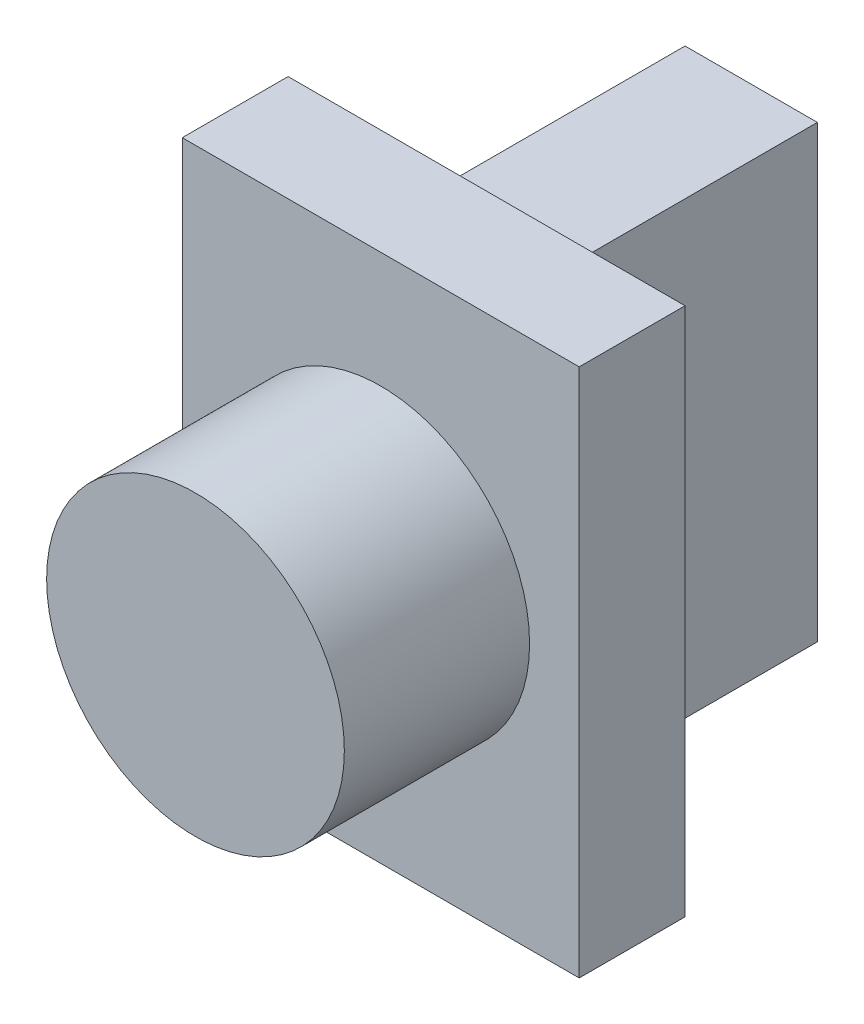
ISO-10303-21;
HEADER;
FILE_DESCRIPTION(('STEP AP214'),'2;1');
FILE_NAME('part.step','',(''),(''),'','','');
FILE_SCHEMA(('AUTOMOTIVE_DESIGN { 1 0 10303 214 1 1 1 1 }'));
ENDSEC;
DATA;
#1=APPLICATION_CONTEXT('core data for automotive mechanical design processes');
#2=APPLICATION_PROTOCOL_DEFINITION('international standard','automotive_design',2000,#1);
#3=PRODUCT_CONTEXT('',#1,'mechanical');
#4=PRODUCT('Part','Part','',(#3));
#5=PRODUCT_RELATED_PRODUCT_CATEGORY('part','',(#4));
#6=PRODUCT_DEFINITION_FORMATION('','',#4);
#7=PRODUCT_DEFINITION_CONTEXT('part definition',#1,'design');
#8=PRODUCT_DEFINITION('design','',#6,#7);
#9=PRODUCT_DEFINITION_SHAPE('','',#8);
#10=(LENGTH_UNIT() NAMED_UNIT(*) SI_UNIT(.MILLI.,.METRE.));
#11=(NAMED_UNIT(*) PLANE_ANGLE_UNIT() SI_UNIT($,.RADIAN.));
#12=(NAMED_UNIT(*) SI_UNIT($,.STERADIAN.) SOLID_ANGLE_UNIT());
#13=UNCERTAINTY_MEASURE_WITH_UNIT(LENGTH_MEASURE(1.E-05),#10,'distance_accuracy_value','');
#14=(GEOMETRIC_REPRESENTATION_CONTEXT(3) GLOBAL_UNCERTAINTY_ASSIGNED_CONTEXT((#13)) GLOBAL_UNIT_ASSIGNED_CONTEXT((#10,
#11,#12)) REPRESENTATION_CONTEXT('',''));
#15=CARTESIAN_POINT('',(0.,0.,0.));
#16=DIRECTION('',(0.,0.,1.));
#17=DIRECTION('',(1.,0.,0.));
#18=AXIS2_PLACEMENT_3D('',#15,#16,#17);
#19=CARTESIAN_POINT('',(-15.,-20.,8.00000000000001));
#20=DIRECTION('',(0.,0.,1.));
#21=DIRECTION('',(1.,0.,0.));
#22=AXIS2_PLACEMENT_3D('',#19,#20,#21);
#23=PLANE('',#22);
#24=DIRECTION('',(0.,-1.,0.));
#25=VECTOR('',#24,1.);
#26=CARTESIAN_POINT('',(-15.,20.,8.00000000000001));
#27=LINE('',#26,#25);
#28=CARTESIAN_POINT('',(-15.,20.,8.00000000000001));
#29=VERTEX_POINT('',#28);
#30=CARTESIAN_POINT('',(-15.,-20.,8.00000000000001));
#31=VERTEX_POINT('',#30);
#32=EDGE_CURVE('E137',#29,#31,#27,.T.);
#33=ORIENTED_EDGE('',*,*,#32,.T.);
#34=DIRECTION('',(1.,0.,0.));
#35=VECTOR('',#34,1.);
#36=CARTESIAN_POINT('',(-15.,-20.,8.00000000000001));
#37=LINE('',#36,#35);
#38=CARTESIAN_POINT('',(15.,-20.,8.00000000000001));
#39=VERTEX_POINT('',#38);
#40=EDGE_CURVE('E140',#31,#39,#37,.T.);
#41=ORIENTED_EDGE('',*,*,#40,.T.);
#42=DIRECTION('',(0.,1.,0.));
#43=VECTOR('',#42,1.);
#44=CARTESIAN_POINT('',(15.,20.,8.00000000000001));
#45=LINE('',#44,#43);
#46=CARTESIAN_POINT('',(15.,20.,8.00000000000001));
#47=VERTEX_POINT('',#46);
#48=EDGE_CURVE('E142',#39,#47,#45,.T.);
#49=ORIENTED_EDGE('',*,*,#48,.T.);
#50=DIRECTION('',(-1.,0.,0.));
#51=VECTOR('',#50,1.);
#52=CARTESIAN_POINT('',(-15.,20.,8.00000000000001));
#53=LINE('',#52,#51);
#54=EDGE_CURVE('E144',#47,#29,#53,.T.);
#55=ORIENTED_EDGE('',*,*,#54,.T.);
#56=EDGE_LOOP('',(#33,#41,#49,#55));
#57=FACE_BOUND('',#56,.T.);
#58=CARTESIAN_POINT('',(0.,0.,8.00000000000001));
#59=DIRECTION('',(0.,0.,1.));
#60=DIRECTION('',(1.,0.,0.));
#61=AXIS2_PLACEMENT_3D('',#58,#59,#60);
#62=CIRCLE('',#61,11.25);
#63=CARTESIAN_POINT('',(11.25,0.,8.00000000000001));
#64=VERTEX_POINT('',#63);
#65=EDGE_CURVE('E218',#64,#64,#62,.T.);
#66=ORIENTED_EDGE('',*,*,#65,.F.);
#67=EDGE_LOOP('',(#66));
#68=FACE_BOUND('',#67,.T.);
#69=ADVANCED_FACE('F33',(#57,#68),#23,.T.);
#70=CARTESIAN_POINT('',(-15.,-20.,0.));
#71=DIRECTION('',(0.,0.,1.));
#72=DIRECTION('',(1.,0.,0.));
#73=AXIS2_PLACEMENT_3D('',#70,#71,#72);
#74=PLANE('',#73);
#75=DIRECTION('',(0.,-1.,0.));
#76=VECTOR('',#75,1.);
#77=CARTESIAN_POINT('',(-15.,20.,0.));
#78=LINE('',#77,#76);
#79=CARTESIAN_POINT('',(-15.,20.,0.));
#80=VERTEX_POINT('',#79);
#81=CARTESIAN_POINT('',(-15.,-20.,0.));
#82=VERTEX_POINT('',#81);
#83=EDGE_CURVE('E128',#80,#82,#78,.T.);
#84=ORIENTED_EDGE('',*,*,#83,.F.);
#85=DIRECTION('',(-1.,0.,0.));
#86=VECTOR('',#85,1.);
#87=CARTESIAN_POINT('',(-15.,20.,0.));
#88=LINE('',#87,#86);
#89=CARTESIAN_POINT('',(15.,20.,0.));
#90=VERTEX_POINT('',#89);
#91=EDGE_CURVE('E135',#90,#80,#88,.T.);
#92=ORIENTED_EDGE('',*,*,#91,.F.);
#93=DIRECTION('',(0.,1.,0.));
#94=VECTOR('',#93,1.);
#95=CARTESIAN_POINT('',(15.,20.,0.));
#96=LINE('',#95,#94);
#97=CARTESIAN_POINT('',(15.,-20.,0.));
#98=VERTEX_POINT('',#97);
#99=EDGE_CURVE('E133',#98,#90,#96,.T.);
#100=ORIENTED_EDGE('',*,*,#99,.F.);
#101=DIRECTION('',(1.,0.,0.));
#102=VECTOR('',#101,1.);
#103=CARTESIAN_POINT('',(-15.,-20.,0.));
#104=LINE('',#103,#102);
#105=EDGE_CURVE('E131',#82,#98,#104,.T.);
#106=ORIENTED_EDGE('',*,*,#105,.F.);
#107=EDGE_LOOP('',(#84,#92,#100,#106));
#108=FACE_BOUND('',#107,.T.);
#109=DIRECTION('',(0.,-1.,0.));
#110=VECTOR('',#109,1.);
#111=CARTESIAN_POINT('',(5.,17.,0.));
#112=LINE('',#111,#110);
#113=CARTESIAN_POINT('',(5.,17.,0.));
#114=VERTEX_POINT('',#113);
#115=CARTESIAN_POINT('',(5.,-17.,0.));
#116=VERTEX_POINT('',#115);
#117=EDGE_CURVE('E94',#114,#116,#112,.T.);
#118=ORIENTED_EDGE('',*,*,#117,.F.);
#119=DIRECTION('',(1.,0.,0.));
#120=VECTOR('',#119,1.);
#121=CARTESIAN_POINT('',(5.,17.,0.));
#122=LINE('',#121,#120);
#123=CARTESIAN_POINT('',(-5.,17.,0.));
#124=VERTEX_POINT('',#123);
#125=EDGE_CURVE('E97',#124,#114,#122,.T.);
#126=ORIENTED_EDGE('',*,*,#125,.F.);
#127=DIRECTION('',(0.,1.,0.));
#128=VECTOR('',#127,1.);
#129=CARTESIAN_POINT('',(-5.,17.,0.));
#130=LINE('',#129,#128);
#131=CARTESIAN_POINT('',(-5.,-17.,0.));
#132=VERTEX_POINT('',#131);
#133=EDGE_CURVE('E53',#132,#124,#130,.T.);
#134=ORIENTED_EDGE('',*,*,#133,.F.);
#135=DIRECTION('',(-1.,0.,0.));
#136=VECTOR('',#135,1.);
#137=CARTESIAN_POINT('',(5.,-17.,0.));
#138=LINE('',#137,#136);
#139=EDGE_CURVE('E48',#116,#132,#138,.T.);
#140=ORIENTED_EDGE('',*,*,#139,.F.);
#141=EDGE_LOOP('',(#118,#126,#134,#140));
#142=FACE_BOUND('',#141,.T.);
#143=ADVANCED_FACE('F96',(#108,#142),#74,.F.);
#144=CARTESIAN_POINT('',(-15.,20.,8.00000000000001));
#145=DIRECTION('',(1.,0.,0.));
#146=DIRECTION('',(0.,0.,-1.));
#147=AXIS2_PLACEMENT_3D('',#144,#145,#146);
#148=PLANE('',#147);
#149=ORIENTED_EDGE('',*,*,#83,.T.);
#150=DIRECTION('',(0.,0.,-1.));
#151=VECTOR('',#150,1.);
#152=CARTESIAN_POINT('',(-15.,-20.,8.00000000000001));
#153=LINE('',#152,#151);
#154=EDGE_CURVE('E11',#31,#82,#153,.T.);
#155=ORIENTED_EDGE('',*,*,#154,.F.);
#156=ORIENTED_EDGE('',*,*,#32,.F.);
#157=DIRECTION('',(0.,0.,-1.));
#158=VECTOR('',#157,1.);
#159=CARTESIAN_POINT('',(-15.,20.,8.00000000000001));
#160=LINE('',#159,#158);
#161=EDGE_CURVE('E146',#29,#80,#160,.T.);
#162=ORIENTED_EDGE('',*,*,#161,.T.);
#163=EDGE_LOOP('',(#149,#155,#156,#162));
#164=FACE_BOUND('',#163,.T.);
#165=ADVANCED_FACE('F35',(#164),#148,.F.);
#166=CARTESIAN_POINT('',(-15.,-20.,8.00000000000001));
#167=DIRECTION('',(0.,1.,0.));
#168=DIRECTION('',(0.,0.,1.));
#169=AXIS2_PLACEMENT_3D('',#166,#167,#168);
#170=PLANE('',#169);
#171=ORIENTED_EDGE('',*,*,#105,.T.);
#172=DIRECTION('',(0.,0.,-1.));
#173=VECTOR('',#172,1.);
#174=CARTESIAN_POINT('',(15.,-20.,8.00000000000001));
#175=LINE('',#174,#173);
#176=EDGE_CURVE('E41',#39,#98,#175,.T.);
#177=ORIENTED_EDGE('',*,*,#176,.F.);
#178=ORIENTED_EDGE('',*,*,#40,.F.);
#179=ORIENTED_EDGE('',*,*,#154,.T.);
#180=EDGE_LOOP('',(#171,#177,#178,#179));
#181=FACE_BOUND('',#180,.T.);
#182=ADVANCED_FACE('F171',(#181),#170,.F.);
#183=CARTESIAN_POINT('',(15.,20.,8.00000000000001));
#184=DIRECTION('',(-1.,0.,0.));
#185=DIRECTION('',(0.,-1.,0.));
#186=AXIS2_PLACEMENT_3D('',#183,#184,#185);
#187=PLANE('',#186);
#188=ORIENTED_EDGE('',*,*,#99,.T.);
#189=DIRECTION('',(0.,0.,-1.));
#190=VECTOR('',#189,1.);
#191=CARTESIAN_POINT('',(15.,20.,8.00000000000001));
#192=LINE('',#191,#190);
#193=EDGE_CURVE('E149',#47,#90,#192,.T.);
#194=ORIENTED_EDGE('',*,*,#193,.F.);
#195=ORIENTED_EDGE('',*,*,#48,.F.);
#196=ORIENTED_EDGE('',*,*,#176,.T.);
#197=EDGE_LOOP('',(#188,#194,#195,#196));
#198=FACE_BOUND('',#197,.T.);
#199=ADVANCED_FACE('F156',(#198),#187,.F.);
#200=CARTESIAN_POINT('',(-15.,20.,8.00000000000001));
#201=DIRECTION('',(0.,-1.,0.));
#202=DIRECTION('',(0.,0.,-1.));
#203=AXIS2_PLACEMENT_3D('',#200,#201,#202);
#204=PLANE('',#203);
#205=ORIENTED_EDGE('',*,*,#91,.T.);
#206=ORIENTED_EDGE('',*,*,#161,.F.);
#207=ORIENTED_EDGE('',*,*,#54,.F.);
#208=ORIENTED_EDGE('',*,*,#193,.T.);
#209=EDGE_LOOP('',(#205,#206,#207,#208));
#210=FACE_BOUND('',#209,.T.);
#211=ADVANCED_FACE('F164',(#210),#204,.F.);
#212=CARTESIAN_POINT('',(5.,17.,-20.));
#213=DIRECTION('',(-1.,0.,0.));
#214=DIRECTION('',(0.,-1.,0.));
#215=AXIS2_PLACEMENT_3D('',#212,#213,#214);
#216=PLANE('',#215);
#217=ORIENTED_EDGE('',*,*,#117,.T.);
#218=DIRECTION('',(0.,0.,1.));
#219=VECTOR('',#218,1.);
#220=CARTESIAN_POINT('',(5.,-17.,-20.));
#221=LINE('',#220,#219);
#222=CARTESIAN_POINT('',(5.,-17.,-20.));
#223=VERTEX_POINT('',#222);
#224=EDGE_CURVE('E126',#223,#116,#221,.T.);
#225=ORIENTED_EDGE('',*,*,#224,.F.);
#226=DIRECTION('',(0.,-1.,0.));
#227=VECTOR('',#226,1.);
#228=CARTESIAN_POINT('',(5.,17.,-20.));
#229=LINE('',#228,#227);
#230=CARTESIAN_POINT('',(5.,17.,-20.));
#231=VERTEX_POINT('',#230);
#232=EDGE_CURVE('E112',#231,#223,#229,.T.);
#233=ORIENTED_EDGE('',*,*,#232,.F.);
#234=DIRECTION('',(0.,0.,1.));
#235=VECTOR('',#234,1.);
#236=CARTESIAN_POINT('',(5.,17.,-20.));
#237=LINE('',#236,#235);
#238=EDGE_CURVE('E108',#231,#114,#237,.T.);
#239=ORIENTED_EDGE('',*,*,#238,.T.);
#240=EDGE_LOOP('',(#217,#225,#233,#239));
#241=FACE_BOUND('',#240,.T.);
#242=ADVANCED_FACE('F114',(#241),#216,.F.);
#243=CARTESIAN_POINT('',(5.,-17.,-20.));
#244=DIRECTION('',(0.,1.,0.));
#245=DIRECTION('',(0.,0.,1.));
#246=AXIS2_PLACEMENT_3D('',#243,#244,#245);
#247=PLANE('',#246);
#248=ORIENTED_EDGE('',*,*,#139,.T.);
#249=DIRECTION('',(0.,0.,1.));
#250=VECTOR('',#249,1.);
#251=CARTESIAN_POINT('',(-5.,-17.,-20.));
#252=LINE('',#251,#250);
#253=CARTESIAN_POINT('',(-5.,-17.,-20.));
#254=VERTEX_POINT('',#253);
#255=EDGE_CURVE('E118',#254,#132,#252,.T.);
#256=ORIENTED_EDGE('',*,*,#255,.F.);
#257=DIRECTION('',(-1.,0.,0.));
#258=VECTOR('',#257,1.);
#259=CARTESIAN_POINT('',(5.,-17.,-20.));
#260=LINE('',#259,#258);
#261=EDGE_CURVE('E226',#223,#254,#260,.T.);
#262=ORIENTED_EDGE('',*,*,#261,.F.);
#263=ORIENTED_EDGE('',*,*,#224,.T.);
#264=EDGE_LOOP('',(#248,#256,#262,#263));
#265=FACE_BOUND('',#264,.T.);
#266=ADVANCED_FACE('F190',(#265),#247,.F.);
#267=CARTESIAN_POINT('',(-5.,17.,-20.));
#268=DIRECTION('',(1.,0.,0.));
#269=DIRECTION('',(0.,1.,0.));
#270=AXIS2_PLACEMENT_3D('',#267,#268,#269);
#271=PLANE('',#270);
#272=ORIENTED_EDGE('',*,*,#133,.T.);
#273=DIRECTION('',(0.,0.,1.));
#274=VECTOR('',#273,1.);
#275=CARTESIAN_POINT('',(-5.,17.,-20.));
#276=LINE('',#275,#274);
#277=CARTESIAN_POINT('',(-5.,17.,-20.));
#278=VERTEX_POINT('',#277);
#279=EDGE_CURVE('E111',#278,#124,#276,.T.);
#280=ORIENTED_EDGE('',*,*,#279,.F.);
#281=DIRECTION('',(0.,1.,0.));
#282=VECTOR('',#281,1.);
#283=CARTESIAN_POINT('',(-5.,17.,-20.));
#284=LINE('',#283,#282);
#285=EDGE_CURVE('E120',#254,#278,#284,.T.);
#286=ORIENTED_EDGE('',*,*,#285,.F.);
#287=ORIENTED_EDGE('',*,*,#255,.T.);
#288=EDGE_LOOP('',(#272,#280,#286,#287));
#289=FACE_BOUND('',#288,.T.);
#290=ADVANCED_FACE('F194',(#289),#271,.F.);
#291=CARTESIAN_POINT('',(5.,17.,-20.));
#292=DIRECTION('',(0.,-1.,0.));
#293=DIRECTION('',(0.,0.,-1.));
#294=AXIS2_PLACEMENT_3D('',#291,#292,#293);
#295=PLANE('',#294);
#296=ORIENTED_EDGE('',*,*,#125,.T.);
#297=ORIENTED_EDGE('',*,*,#238,.F.);
#298=DIRECTION('',(1.,0.,0.));
#299=VECTOR('',#298,1.);
#300=CARTESIAN_POINT('',(5.,17.,-20.));
#301=LINE('',#300,#299);
#302=EDGE_CURVE('E116',#278,#231,#301,.T.);
#303=ORIENTED_EDGE('',*,*,#302,.F.);
#304=ORIENTED_EDGE('',*,*,#279,.T.);
#305=EDGE_LOOP('',(#296,#297,#303,#304));
#306=FACE_BOUND('',#305,.T.);
#307=ADVANCED_FACE('F106',(#306),#295,.F.);
#308=CARTESIAN_POINT('',(5.,-17.,-20.));
#309=DIRECTION('',(0.,0.,-1.));
#310=DIRECTION('',(-1.,0.,0.));
#311=AXIS2_PLACEMENT_3D('',#308,#309,#310);
#312=PLANE('',#311);
#313=ORIENTED_EDGE('',*,*,#232,.T.);
#314=ORIENTED_EDGE('',*,*,#261,.T.);
#315=ORIENTED_EDGE('',*,*,#285,.T.);
#316=ORIENTED_EDGE('',*,*,#302,.T.);
#317=EDGE_LOOP('',(#313,#314,#315,#316));
#318=FACE_BOUND('',#317,.T.);
#319=ADVANCED_FACE('F203',(#318),#312,.T.);
#320=CARTESIAN_POINT('',(0.,0.,22.));
#321=DIRECTION('',(0.,0.,-1.));
#322=DIRECTION('',(-1.,0.,0.));
#323=AXIS2_PLACEMENT_3D('',#320,#321,#322);
#324=CYLINDRICAL_SURFACE('',#323,11.25);
#325=CARTESIAN_POINT('',(0.,0.,22.));
#326=DIRECTION('',(0.,0.,1.));
#327=DIRECTION('',(1.,0.,0.));
#328=AXIS2_PLACEMENT_3D('',#325,#326,#327);
#329=CIRCLE('',#328,11.25);
#330=CARTESIAN_POINT('',(11.25,0.,22.));
#331=VERTEX_POINT('',#330);
#332=EDGE_CURVE('E101',#331,#331,#329,.T.);
#333=ORIENTED_EDGE('',*,*,#332,.F.);
#334=EDGE_LOOP('',(#333));
#335=FACE_BOUND('',#334,.T.);
#336=ORIENTED_EDGE('',*,*,#65,.T.);
#337=EDGE_LOOP('',(#336));
#338=FACE_BOUND('',#337,.T.);
#339=ADVANCED_FACE('F206',(#335,#338),#324,.T.);
#340=CARTESIAN_POINT('',(0.,0.,22.));
#341=DIRECTION('',(0.,0.,1.));
#342=DIRECTION('',(1.,0.,0.));
#343=AXIS2_PLACEMENT_3D('',#340,#341,#342);
#344=PLANE('',#343);
#345=ORIENTED_EDGE('',*,*,#332,.T.);
#346=EDGE_LOOP('',(#345));
#347=FACE_BOUND('',#346,.T.);
#348=ADVANCED_FACE('F210',(#347),#344,.T.);
#349=CLOSED_SHELL('',(#69,#143,#165,#182,#199,#211,#242,#266,#290,#307,#319,#339,#348));
#350=MANIFOLD_SOLID_BREP('B2',#349);
#351=ADVANCED_BREP_SHAPE_REPRESENTATION('',(#18,#350),#14);
#352=SHAPE_DEFINITION_REPRESENTATION(#9,#351);
ENDSEC;
END-ISO-10303-21;
